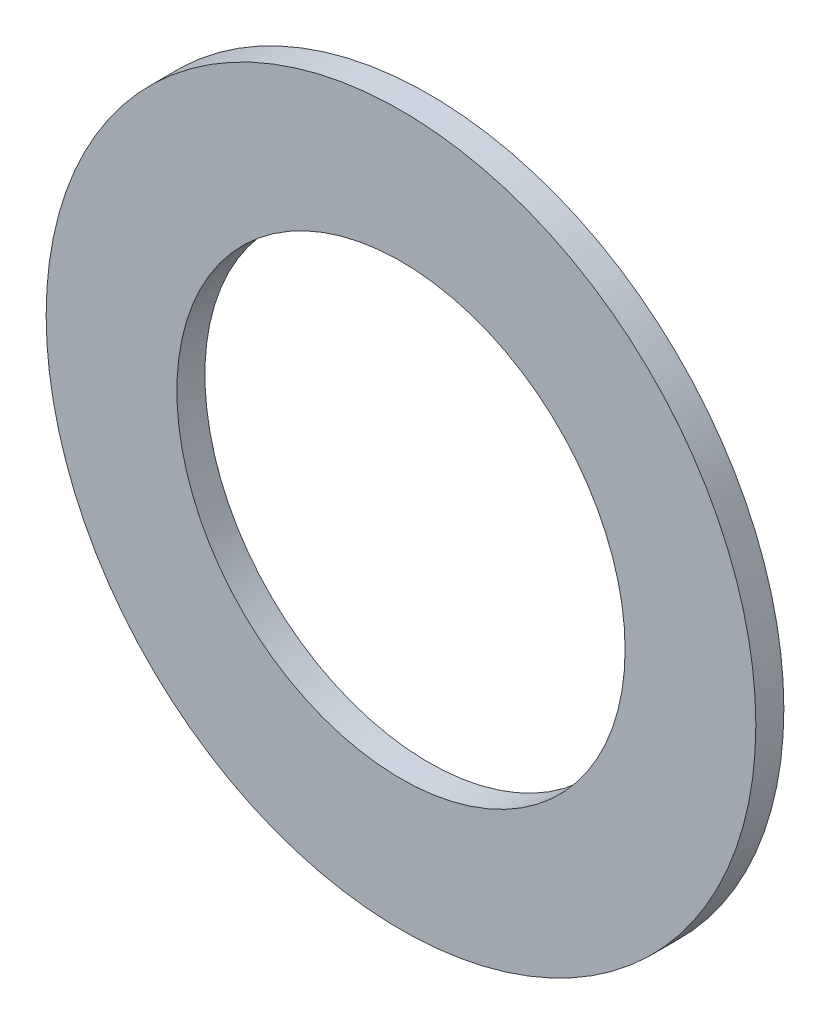
ISO-10303-21;
HEADER;
FILE_DESCRIPTION(('STEP AP214'),'2;1');
FILE_NAME('part.step','',(''),(''),'','','');
FILE_SCHEMA(('AUTOMOTIVE_DESIGN { 1 0 10303 214 1 1 1 1 }'));
ENDSEC;
DATA;
#1=APPLICATION_CONTEXT('core data for automotive mechanical design processes');
#2=APPLICATION_PROTOCOL_DEFINITION('international standard','automotive_design',2000,#1);
#3=PRODUCT_CONTEXT('',#1,'mechanical');
#4=PRODUCT('Part','Part','',(#3));
#5=PRODUCT_RELATED_PRODUCT_CATEGORY('part','',(#4));
#6=PRODUCT_DEFINITION_FORMATION('','',#4);
#7=PRODUCT_DEFINITION_CONTEXT('part definition',#1,'design');
#8=PRODUCT_DEFINITION('design','',#6,#7);
#9=PRODUCT_DEFINITION_SHAPE('','',#8);
#10=(LENGTH_UNIT() NAMED_UNIT(*) SI_UNIT(.MILLI.,.METRE.));
#11=(NAMED_UNIT(*) PLANE_ANGLE_UNIT() SI_UNIT($,.RADIAN.));
#12=(NAMED_UNIT(*) SI_UNIT($,.STERADIAN.) SOLID_ANGLE_UNIT());
#13=UNCERTAINTY_MEASURE_WITH_UNIT(LENGTH_MEASURE(1.E-05),#10,'distance_accuracy_value','');
#14=(GEOMETRIC_REPRESENTATION_CONTEXT(3) GLOBAL_UNCERTAINTY_ASSIGNED_CONTEXT((#13)) GLOBAL_UNIT_ASSIGNED_CONTEXT((#10,
#11,#12)) REPRESENTATION_CONTEXT('',''));
#15=CARTESIAN_POINT('',(0.,0.,0.));
#16=DIRECTION('',(0.,0.,1.));
#17=DIRECTION('',(1.,0.,0.));
#18=AXIS2_PLACEMENT_3D('',#15,#16,#17);
#19=CARTESIAN_POINT('',(0.,0.,1.5));
#20=DIRECTION('',(0.,0.,1.));
#21=DIRECTION('',(1.,0.,0.));
#22=AXIS2_PLACEMENT_3D('',#19,#20,#21);
#23=PLANE('',#22);
#24=CARTESIAN_POINT('',(0.,0.,1.5));
#25=DIRECTION('',(0.,0.,1.));
#26=DIRECTION('',(1.,0.,0.));
#27=AXIS2_PLACEMENT_3D('',#24,#25,#26);
#28=CIRCLE('',#27,19.);
#29=CARTESIAN_POINT('',(19.,0.,1.5));
#30=VERTEX_POINT('',#29);
#31=EDGE_CURVE('E10',#30,#30,#28,.T.);
#32=ORIENTED_EDGE('',*,*,#31,.T.);
#33=EDGE_LOOP('',(#32));
#34=FACE_BOUND('',#33,.T.);
#35=CARTESIAN_POINT('',(0.,0.,1.5));
#36=DIRECTION('',(0.,0.,1.));
#37=DIRECTION('',(1.,0.,0.));
#38=AXIS2_PLACEMENT_3D('',#35,#36,#37);
#39=CIRCLE('',#38,12.);
#40=CARTESIAN_POINT('',(12.,0.,1.5));
#41=VERTEX_POINT('',#40);
#42=EDGE_CURVE('E45',#41,#41,#39,.T.);
#43=ORIENTED_EDGE('',*,*,#42,.F.);
#44=EDGE_LOOP('',(#43));
#45=FACE_BOUND('',#44,.T.);
#46=ADVANCED_FACE('F34',(#34,#45),#23,.T.);
#47=CARTESIAN_POINT('',(0.,0.,0.));
#48=DIRECTION('',(0.,0.,1.));
#49=DIRECTION('',(1.,0.,0.));
#50=AXIS2_PLACEMENT_3D('',#47,#48,#49);
#51=PLANE('',#50);
#52=CARTESIAN_POINT('',(0.,0.,0.));
#53=DIRECTION('',(0.,0.,1.));
#54=DIRECTION('',(1.,0.,0.));
#55=AXIS2_PLACEMENT_3D('',#52,#53,#54);
#56=CIRCLE('',#55,19.);
#57=CARTESIAN_POINT('',(19.,0.,0.));
#58=VERTEX_POINT('',#57);
#59=EDGE_CURVE('E38',#58,#58,#56,.T.);
#60=ORIENTED_EDGE('',*,*,#59,.F.);
#61=EDGE_LOOP('',(#60));
#62=FACE_BOUND('',#61,.T.);
#63=CARTESIAN_POINT('',(0.,0.,0.));
#64=DIRECTION('',(0.,0.,1.));
#65=DIRECTION('',(1.,0.,0.));
#66=AXIS2_PLACEMENT_3D('',#63,#64,#65);
#67=CIRCLE('',#66,12.);
#68=CARTESIAN_POINT('',(12.,0.,0.));
#69=VERTEX_POINT('',#68);
#70=EDGE_CURVE('E47',#69,#69,#67,.T.);
#71=ORIENTED_EDGE('',*,*,#70,.T.);
#72=EDGE_LOOP('',(#71));
#73=FACE_BOUND('',#72,.T.);
#74=ADVANCED_FACE('F57',(#62,#73),#51,.F.);
#75=CARTESIAN_POINT('',(0.,0.,1.5));
#76=DIRECTION('',(0.,0.,-1.));
#77=DIRECTION('',(-1.,0.,0.));
#78=AXIS2_PLACEMENT_3D('',#75,#76,#77);
#79=CYLINDRICAL_SURFACE('',#78,19.);
#80=ORIENTED_EDGE('',*,*,#31,.F.);
#81=EDGE_LOOP('',(#80));
#82=FACE_BOUND('',#81,.T.);
#83=ORIENTED_EDGE('',*,*,#59,.T.);
#84=EDGE_LOOP('',(#83));
#85=FACE_BOUND('',#84,.T.);
#86=ADVANCED_FACE('F36',(#82,#85),#79,.T.);
#87=CARTESIAN_POINT('',(0.,0.,1.5));
#88=DIRECTION('',(0.,0.,-1.));
#89=DIRECTION('',(-1.,0.,0.));
#90=AXIS2_PLACEMENT_3D('',#87,#88,#89);
#91=CYLINDRICAL_SURFACE('',#90,12.);
#92=ORIENTED_EDGE('',*,*,#42,.T.);
#93=EDGE_LOOP('',(#92));
#94=FACE_BOUND('',#93,.T.);
#95=ORIENTED_EDGE('',*,*,#70,.F.);
#96=EDGE_LOOP('',(#95));
#97=FACE_BOUND('',#96,.T.);
#98=ADVANCED_FACE('F53',(#94,#97),#91,.F.);
#99=CLOSED_SHELL('',(#46,#74,#86,#98));
#100=MANIFOLD_SOLID_BREP('B2',#99);
#101=ADVANCED_BREP_SHAPE_REPRESENTATION('',(#18,#100),#14);
#102=SHAPE_DEFINITION_REPRESENTATION(#9,#101);
ENDSEC;
END-ISO-10303-21;
